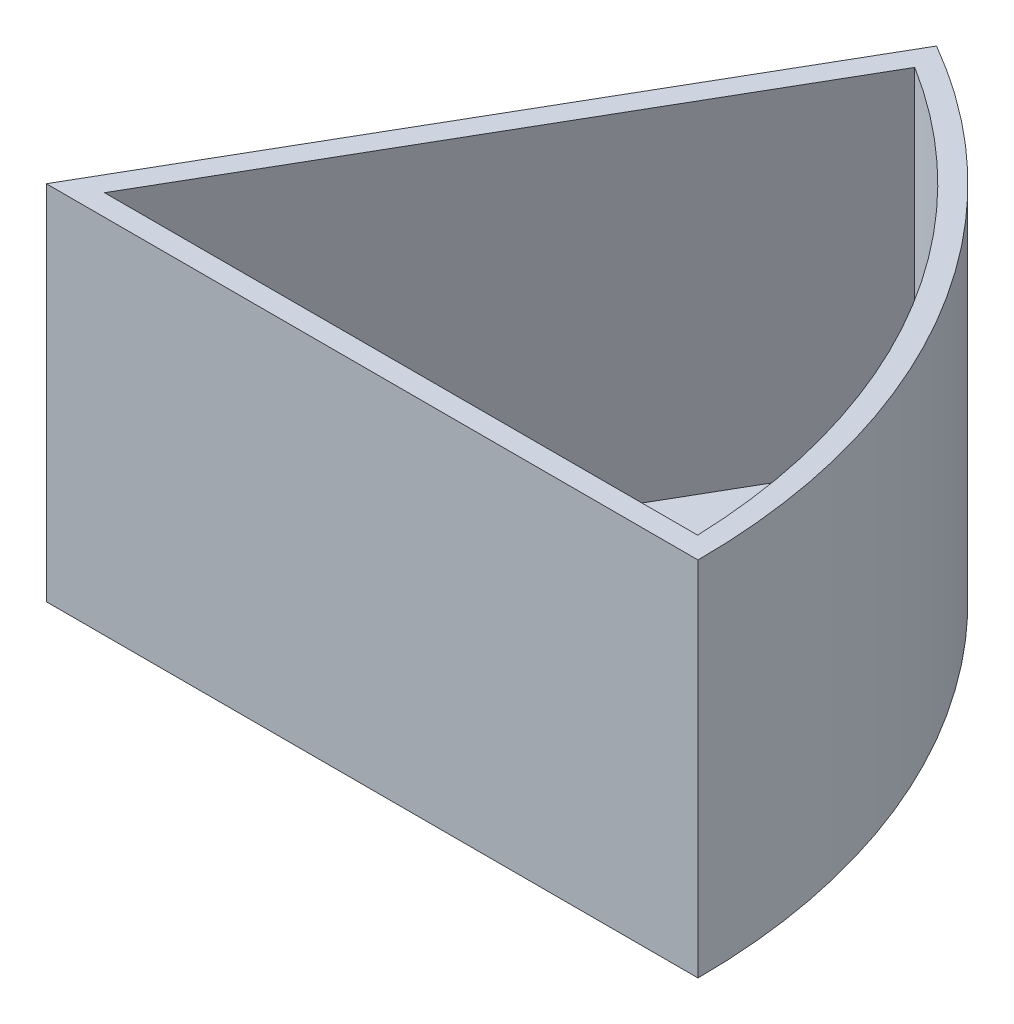
ISO-10303-21;
HEADER;
FILE_DESCRIPTION(('STEP AP214'),'2;1');
FILE_NAME('part.step','',(''),(''),'','','');
FILE_SCHEMA(('AUTOMOTIVE_DESIGN { 1 0 10303 214 1 1 1 1 }'));
ENDSEC;
DATA;
#1=APPLICATION_CONTEXT('core data for automotive mechanical design processes');
#2=APPLICATION_PROTOCOL_DEFINITION('international standard','automotive_design',2000,#1);
#3=PRODUCT_CONTEXT('',#1,'mechanical');
#4=PRODUCT('Part','Part','',(#3));
#5=PRODUCT_RELATED_PRODUCT_CATEGORY('part','',(#4));
#6=PRODUCT_DEFINITION_FORMATION('','',#4);
#7=PRODUCT_DEFINITION_CONTEXT('part definition',#1,'design');
#8=PRODUCT_DEFINITION('design','',#6,#7);
#9=PRODUCT_DEFINITION_SHAPE('','',#8);
#10=(LENGTH_UNIT() NAMED_UNIT(*) SI_UNIT(.MILLI.,.METRE.));
#11=(NAMED_UNIT(*) PLANE_ANGLE_UNIT() SI_UNIT($,.RADIAN.));
#12=(NAMED_UNIT(*) SI_UNIT($,.STERADIAN.) SOLID_ANGLE_UNIT());
#13=UNCERTAINTY_MEASURE_WITH_UNIT(LENGTH_MEASURE(1.E-05),#10,'distance_accuracy_value','');
#14=(GEOMETRIC_REPRESENTATION_CONTEXT(3) GLOBAL_UNCERTAINTY_ASSIGNED_CONTEXT((#13)) GLOBAL_UNIT_ASSIGNED_CONTEXT((#10,
#11,#12)) REPRESENTATION_CONTEXT('',''));
#15=CARTESIAN_POINT('',(0.,0.,0.));
#16=DIRECTION('',(0.,0.,1.));
#17=DIRECTION('',(1.,0.,0.));
#18=AXIS2_PLACEMENT_3D('',#15,#16,#17);
#19=CARTESIAN_POINT('',(0.,5.,0.));
#20=DIRECTION('',(0.86602540378444,0.,0.499999999999998));
#21=DIRECTION('',(0.499999999999998,0.,-0.86602540378444));
#22=AXIS2_PLACEMENT_3D('',#19,#20,#21);
#23=PLANE('',#22);
#24=DIRECTION('',(-0.499999999999998,0.,0.86602540378444));
#25=VECTOR('',#24,1.);
#26=CARTESIAN_POINT('',(0.,0.,0.));
#27=LINE('',#26,#25);
#28=CARTESIAN_POINT('',(76.4999999999996,0.,-132.501886779019));
#29=VERTEX_POINT('',#28);
#30=CARTESIAN_POINT('',(0.,0.,0.));
#31=VERTEX_POINT('',#30);
#32=EDGE_CURVE('E142',#29,#31,#27,.T.);
#33=ORIENTED_EDGE('',*,*,#32,.T.);
#34=DIRECTION('',(0.,-1.,0.));
#35=VECTOR('',#34,1.);
#36=CARTESIAN_POINT('',(0.,5.,0.));
#37=LINE('',#36,#35);
#38=CARTESIAN_POINT('',(0.,85.,0.));
#39=VERTEX_POINT('',#38);
#40=EDGE_CURVE('E12',#39,#31,#37,.T.);
#41=ORIENTED_EDGE('',*,*,#40,.F.);
#42=DIRECTION('',(-0.499999999999998,0.,0.86602540378444));
#43=VECTOR('',#42,1.);
#44=CARTESIAN_POINT('',(76.4999999999996,85.,-132.501886779019));
#45=LINE('',#44,#43);
#46=CARTESIAN_POINT('',(76.4999999999996,85.,-132.501886779019));
#47=VERTEX_POINT('',#46);
#48=EDGE_CURVE('E136',#47,#39,#45,.T.);
#49=ORIENTED_EDGE('',*,*,#48,.F.);
#50=DIRECTION('',(0.,-1.,0.));
#51=VECTOR('',#50,1.);
#52=CARTESIAN_POINT('',(76.4999999999996,5.,-132.501886779019));
#53=LINE('',#52,#51);
#54=EDGE_CURVE('E149',#47,#29,#53,.T.);
#55=ORIENTED_EDGE('',*,*,#54,.T.);
#56=EDGE_LOOP('',(#33,#41,#49,#55));
#57=FACE_BOUND('',#56,.T.);
#58=ADVANCED_FACE('F54',(#57),#23,.F.);
#59=CARTESIAN_POINT('',(0.,5.,0.));
#60=DIRECTION('',(0.,0.,-1.));
#61=DIRECTION('',(-1.,0.,0.));
#62=AXIS2_PLACEMENT_3D('',#59,#60,#61);
#63=PLANE('',#62);
#64=DIRECTION('',(1.,0.,0.));
#65=VECTOR('',#64,1.);
#66=CARTESIAN_POINT('',(0.,0.,0.));
#67=LINE('',#66,#65);
#68=CARTESIAN_POINT('',(153.,0.,0.));
#69=VERTEX_POINT('',#68);
#70=EDGE_CURVE('E145',#31,#69,#67,.T.);
#71=ORIENTED_EDGE('',*,*,#70,.T.);
#72=DIRECTION('',(0.,-1.,0.));
#73=VECTOR('',#72,1.);
#74=CARTESIAN_POINT('',(153.,5.,0.));
#75=LINE('',#74,#73);
#76=CARTESIAN_POINT('',(153.,85.,0.));
#77=VERTEX_POINT('',#76);
#78=EDGE_CURVE('E61',#77,#69,#75,.T.);
#79=ORIENTED_EDGE('',*,*,#78,.F.);
#80=DIRECTION('',(1.,0.,0.));
#81=VECTOR('',#80,1.);
#82=CARTESIAN_POINT('',(0.,85.,0.));
#83=LINE('',#82,#81);
#84=EDGE_CURVE('E139',#39,#77,#83,.T.);
#85=ORIENTED_EDGE('',*,*,#84,.F.);
#86=ORIENTED_EDGE('',*,*,#40,.T.);
#87=EDGE_LOOP('',(#71,#79,#85,#86));
#88=FACE_BOUND('',#87,.T.);
#89=ADVANCED_FACE('F164',(#88),#63,.F.);
#90=CARTESIAN_POINT('',(0.,5.,0.));
#91=DIRECTION('',(0.,-1.,0.));
#92=DIRECTION('',(0.,0.,-1.));
#93=AXIS2_PLACEMENT_3D('',#90,#91,#92);
#94=CYLINDRICAL_SURFACE('',#93,153.);
#95=CARTESIAN_POINT('',(0.,0.,0.));
#96=DIRECTION('',(0.,1.,0.));
#97=DIRECTION('',(0.,0.,1.));
#98=AXIS2_PLACEMENT_3D('',#95,#96,#97);
#99=CIRCLE('',#98,153.);
#100=EDGE_CURVE('E147',#69,#29,#99,.T.);
#101=ORIENTED_EDGE('',*,*,#100,.T.);
#102=ORIENTED_EDGE('',*,*,#54,.F.);
#103=CARTESIAN_POINT('',(0.,85.,0.));
#104=DIRECTION('',(0.,1.,0.));
#105=DIRECTION('',(0.,0.,1.));
#106=AXIS2_PLACEMENT_3D('',#103,#104,#105);
#107=CIRCLE('',#106,153.);
#108=EDGE_CURVE('E121',#77,#47,#107,.T.);
#109=ORIENTED_EDGE('',*,*,#108,.F.);
#110=ORIENTED_EDGE('',*,*,#78,.T.);
#111=EDGE_LOOP('',(#101,#102,#109,#110));
#112=FACE_BOUND('',#111,.T.);
#113=ADVANCED_FACE('F155',(#112),#94,.T.);
#114=CARTESIAN_POINT('',(0.,0.,0.));
#115=DIRECTION('',(0.,1.,0.));
#116=DIRECTION('',(0.,0.,1.));
#117=AXIS2_PLACEMENT_3D('',#114,#115,#116);
#118=PLANE('',#117);
#119=ORIENTED_EDGE('',*,*,#32,.F.);
#120=ORIENTED_EDGE('',*,*,#100,.F.);
#121=ORIENTED_EDGE('',*,*,#70,.F.);
#122=EDGE_LOOP('',(#119,#120,#121));
#123=FACE_BOUND('',#122,.T.);
#124=ADVANCED_FACE('F160',(#123),#118,.F.);
#125=CARTESIAN_POINT('',(0.,85.,0.));
#126=DIRECTION('',(0.,1.,0.));
#127=DIRECTION('',(0.,0.,1.));
#128=AXIS2_PLACEMENT_3D('',#125,#126,#127);
#129=PLANE('',#128);
#130=ORIENTED_EDGE('',*,*,#108,.T.);
#131=ORIENTED_EDGE('',*,*,#48,.T.);
#132=ORIENTED_EDGE('',*,*,#84,.T.);
#133=EDGE_LOOP('',(#130,#131,#132));
#134=FACE_BOUND('',#133,.T.);
#135=DIRECTION('',(-0.499999999999998,0.,0.86602540378444));
#136=VECTOR('',#135,1.);
#137=CARTESIAN_POINT('',(80.8301270189219,85.,-130.001886779019));
#138=LINE('',#137,#136);
#139=CARTESIAN_POINT('',(78.2878852326482,85.,-125.598594840069));
#140=VERTEX_POINT('',#139);
#141=CARTESIAN_POINT('',(8.66025403784436,85.,-5.));
#142=VERTEX_POINT('',#141);
#143=EDGE_CURVE('E114',#140,#142,#138,.T.);
#144=ORIENTED_EDGE('',*,*,#143,.F.);
#145=CARTESIAN_POINT('',(0.,85.,0.));
#146=DIRECTION('',(0.,1.,0.));
#147=DIRECTION('',(1.,0.,0.));
#148=AXIS2_PLACEMENT_3D('',#145,#146,#147);
#149=CIRCLE('',#148,148.);
#150=CARTESIAN_POINT('',(147.915516427453,85.,-5.));
#151=VERTEX_POINT('',#150);
#152=EDGE_CURVE('E105',#151,#140,#149,.T.);
#153=ORIENTED_EDGE('',*,*,#152,.F.);
#154=DIRECTION('',(1.,0.,0.));
#155=VECTOR('',#154,1.);
#156=CARTESIAN_POINT('',(0.,85.,-5.));
#157=LINE('',#156,#155);
#158=EDGE_CURVE('E125',#142,#151,#157,.T.);
#159=ORIENTED_EDGE('',*,*,#158,.F.);
#160=EDGE_LOOP('',(#144,#153,#159));
#161=FACE_BOUND('',#160,.T.);
#162=ADVANCED_FACE('F124',(#134,#161),#129,.T.);
#163=CARTESIAN_POINT('',(0.,85.,0.));
#164=DIRECTION('',(0.,-1.,0.));
#165=DIRECTION('',(0.,0.,-1.));
#166=AXIS2_PLACEMENT_3D('',#163,#164,#165);
#167=CYLINDRICAL_SURFACE('',#166,148.);
#168=CARTESIAN_POINT('',(0.,5.,0.));
#169=DIRECTION('',(0.,1.,0.));
#170=DIRECTION('',(1.,0.,0.));
#171=AXIS2_PLACEMENT_3D('',#168,#169,#170);
#172=CIRCLE('',#171,148.);
#173=CARTESIAN_POINT('',(147.915516427453,5.,-5.));
#174=VERTEX_POINT('',#173);
#175=CARTESIAN_POINT('',(78.2878852326482,5.,-125.598594840069));
#176=VERTEX_POINT('',#175);
#177=EDGE_CURVE('E68',#174,#176,#172,.T.);
#178=ORIENTED_EDGE('',*,*,#177,.F.);
#179=DIRECTION('',(0.,-1.,0.));
#180=VECTOR('',#179,1.);
#181=CARTESIAN_POINT('',(147.915516427453,85.,-5.));
#182=LINE('',#181,#180);
#183=EDGE_CURVE('E110',#151,#174,#182,.T.);
#184=ORIENTED_EDGE('',*,*,#183,.F.);
#185=ORIENTED_EDGE('',*,*,#152,.T.);
#186=DIRECTION('',(0.,-1.,0.));
#187=VECTOR('',#186,1.);
#188=CARTESIAN_POINT('',(78.2878852326482,85.,-125.598594840069));
#189=LINE('',#188,#187);
#190=EDGE_CURVE('E108',#140,#176,#189,.T.);
#191=ORIENTED_EDGE('',*,*,#190,.T.);
#192=EDGE_LOOP('',(#178,#184,#185,#191));
#193=FACE_BOUND('',#192,.T.);
#194=ADVANCED_FACE('F107',(#193),#167,.F.);
#195=CARTESIAN_POINT('',(80.8301270189219,85.,-130.001886779019));
#196=DIRECTION('',(0.86602540378444,0.,0.499999999999998));
#197=DIRECTION('',(0.499999999999998,0.,-0.86602540378444));
#198=AXIS2_PLACEMENT_3D('',#195,#196,#197);
#199=PLANE('',#198);
#200=DIRECTION('',(-0.499999999999998,0.,0.86602540378444));
#201=VECTOR('',#200,1.);
#202=CARTESIAN_POINT('',(80.8301270189219,5.,-130.001886779019));
#203=LINE('',#202,#201);
#204=CARTESIAN_POINT('',(8.66025403784436,5.,-5.));
#205=VERTEX_POINT('',#204);
#206=EDGE_CURVE('E120',#176,#205,#203,.T.);
#207=ORIENTED_EDGE('',*,*,#206,.F.);
#208=ORIENTED_EDGE('',*,*,#190,.F.);
#209=ORIENTED_EDGE('',*,*,#143,.T.);
#210=DIRECTION('',(0.,-1.,0.));
#211=VECTOR('',#210,1.);
#212=CARTESIAN_POINT('',(8.66025403784436,85.,-5.));
#213=LINE('',#212,#211);
#214=EDGE_CURVE('E122',#142,#205,#213,.T.);
#215=ORIENTED_EDGE('',*,*,#214,.T.);
#216=EDGE_LOOP('',(#207,#208,#209,#215));
#217=FACE_BOUND('',#216,.T.);
#218=ADVANCED_FACE('F118',(#217),#199,.T.);
#219=CARTESIAN_POINT('',(0.,85.,-5.));
#220=DIRECTION('',(0.,0.,-1.));
#221=DIRECTION('',(-1.,0.,0.));
#222=AXIS2_PLACEMENT_3D('',#219,#220,#221);
#223=PLANE('',#222);
#224=DIRECTION('',(1.,0.,0.));
#225=VECTOR('',#224,1.);
#226=CARTESIAN_POINT('',(0.,5.,-5.));
#227=LINE('',#226,#225);
#228=EDGE_CURVE('E72',#205,#174,#227,.T.);
#229=ORIENTED_EDGE('',*,*,#228,.F.);
#230=ORIENTED_EDGE('',*,*,#214,.F.);
#231=ORIENTED_EDGE('',*,*,#158,.T.);
#232=ORIENTED_EDGE('',*,*,#183,.T.);
#233=EDGE_LOOP('',(#229,#230,#231,#232));
#234=FACE_BOUND('',#233,.T.);
#235=ADVANCED_FACE('F177',(#234),#223,.T.);
#236=CARTESIAN_POINT('',(0.,5.,0.));
#237=DIRECTION('',(0.,1.,0.));
#238=DIRECTION('',(0.,0.,1.));
#239=AXIS2_PLACEMENT_3D('',#236,#237,#238);
#240=PLANE('',#239);
#241=ORIENTED_EDGE('',*,*,#177,.T.);
#242=ORIENTED_EDGE('',*,*,#206,.T.);
#243=ORIENTED_EDGE('',*,*,#228,.T.);
#244=EDGE_LOOP('',(#241,#242,#243));
#245=FACE_BOUND('',#244,.T.);
#246=ADVANCED_FACE('F174',(#245),#240,.T.);
#247=CLOSED_SHELL('',(#58,#89,#113,#124,#162,#194,#218,#235,#246));
#248=MANIFOLD_SOLID_BREP('B2',#247);
#249=ADVANCED_BREP_SHAPE_REPRESENTATION('',(#18,#248),#14);
#250=SHAPE_DEFINITION_REPRESENTATION(#9,#249);
ENDSEC;
END-ISO-10303-21;
